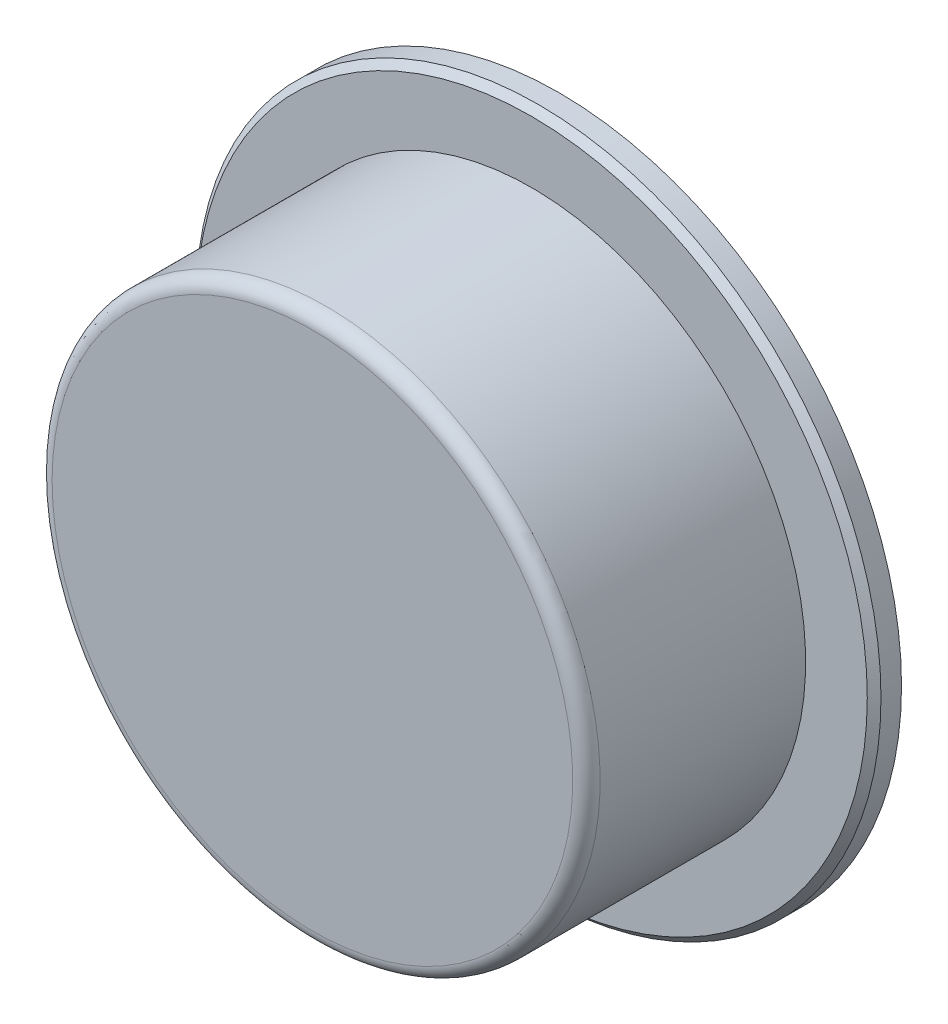
ISO-10303-21;
HEADER;
FILE_DESCRIPTION(('STEP AP214'),'2;1');
FILE_NAME('part.step','',(''),(''),'','','');
FILE_SCHEMA(('AUTOMOTIVE_DESIGN { 1 0 10303 214 1 1 1 1 }'));
ENDSEC;
DATA;
#1=APPLICATION_CONTEXT('core data for automotive mechanical design processes');
#2=APPLICATION_PROTOCOL_DEFINITION('international standard','automotive_design',2000,#1);
#3=PRODUCT_CONTEXT('',#1,'mechanical');
#4=PRODUCT('Part','Part','',(#3));
#5=PRODUCT_RELATED_PRODUCT_CATEGORY('part','',(#4));
#6=PRODUCT_DEFINITION_FORMATION('','',#4);
#7=PRODUCT_DEFINITION_CONTEXT('part definition',#1,'design');
#8=PRODUCT_DEFINITION('design','',#6,#7);
#9=PRODUCT_DEFINITION_SHAPE('','',#8);
#10=(LENGTH_UNIT() NAMED_UNIT(*) SI_UNIT(.MILLI.,.METRE.));
#11=(NAMED_UNIT(*) PLANE_ANGLE_UNIT() SI_UNIT($,.RADIAN.));
#12=(NAMED_UNIT(*) SI_UNIT($,.STERADIAN.) SOLID_ANGLE_UNIT());
#13=UNCERTAINTY_MEASURE_WITH_UNIT(LENGTH_MEASURE(1.E-05),#10,'distance_accuracy_value','');
#14=(GEOMETRIC_REPRESENTATION_CONTEXT(3) GLOBAL_UNCERTAINTY_ASSIGNED_CONTEXT((#13)) GLOBAL_UNIT_ASSIGNED_CONTEXT((#10,
#11,#12)) REPRESENTATION_CONTEXT('',''));
#15=CARTESIAN_POINT('',(0.,0.,0.));
#16=DIRECTION('',(0.,0.,1.));
#17=DIRECTION('',(1.,0.,0.));
#18=AXIS2_PLACEMENT_3D('',#15,#16,#17);
#19=CARTESIAN_POINT('',(0.,0.,3.4));
#20=DIRECTION('',(0.,0.,-1.));
#21=DIRECTION('',(-1.,0.,0.));
#22=AXIS2_PLACEMENT_3D('',#19,#20,#21);
#23=TOROIDAL_SURFACE('',#22,3.8,0.2);
#24=CARTESIAN_POINT('',(0.,0.,3.6));
#25=DIRECTION('',(0.,0.,-1.));
#26=DIRECTION('',(-1.,0.,0.));
#27=AXIS2_PLACEMENT_3D('',#24,#25,#26);
#28=CIRCLE('',#27,3.8);
#29=CARTESIAN_POINT('',(-3.8,0.,3.6));
#30=VERTEX_POINT('',#29);
#31=EDGE_CURVE('E49',#30,#30,#28,.T.);
#32=ORIENTED_EDGE('',*,*,#31,.T.);
#33=EDGE_LOOP('',(#32));
#34=FACE_BOUND('',#33,.T.);
#35=CARTESIAN_POINT('',(0.,0.,3.4));
#36=DIRECTION('',(0.,0.,-1.));
#37=DIRECTION('',(-1.,0.,0.));
#38=AXIS2_PLACEMENT_3D('',#35,#36,#37);
#39=CIRCLE('',#38,4.);
#40=CARTESIAN_POINT('',(-4.,0.,3.4));
#41=VERTEX_POINT('',#40);
#42=EDGE_CURVE('E61',#41,#41,#39,.T.);
#43=ORIENTED_EDGE('',*,*,#42,.F.);
#44=EDGE_LOOP('',(#43));
#45=FACE_BOUND('',#44,.T.);
#46=ADVANCED_FACE('F37',(#34,#45),#23,.T.);
#47=CARTESIAN_POINT('',(3.8,0.,3.6));
#48=DIRECTION('',(0.,0.,1.));
#49=DIRECTION('',(1.,0.,0.));
#50=AXIS2_PLACEMENT_3D('',#47,#48,#49);
#51=PLANE('',#50);
#52=ORIENTED_EDGE('',*,*,#31,.F.);
#53=EDGE_LOOP('',(#52));
#54=FACE_BOUND('',#53,.T.);
#55=ADVANCED_FACE('F69',(#54),#51,.T.);
#56=CARTESIAN_POINT('',(0.,0.,0.));
#57=DIRECTION('',(0.,0.,-1.));
#58=DIRECTION('',(-1.,0.,0.));
#59=AXIS2_PLACEMENT_3D('',#56,#57,#58);
#60=PLANE('',#59);
#61=CARTESIAN_POINT('',(0.,0.,0.));
#62=DIRECTION('',(0.,0.,-1.));
#63=DIRECTION('',(-1.,0.,0.));
#64=AXIS2_PLACEMENT_3D('',#61,#62,#63);
#65=CIRCLE('',#64,5.);
#66=CARTESIAN_POINT('',(-5.,0.,0.));
#67=VERTEX_POINT('',#66);
#68=EDGE_CURVE('E53',#67,#67,#65,.T.);
#69=ORIENTED_EDGE('',*,*,#68,.T.);
#70=EDGE_LOOP('',(#69));
#71=FACE_BOUND('',#70,.T.);
#72=ADVANCED_FACE('F74',(#71),#60,.T.);
#73=CARTESIAN_POINT('',(0.,0.,3.6));
#74=DIRECTION('',(0.,0.,-1.));
#75=DIRECTION('',(-1.,0.,0.));
#76=AXIS2_PLACEMENT_3D('',#73,#74,#75);
#77=CYLINDRICAL_SURFACE('',#76,5.);
#78=CARTESIAN_POINT('',(0.,0.,0.300000000000002));
#79=DIRECTION('',(0.,0.,1.));
#80=DIRECTION('',(1.,0.,0.));
#81=AXIS2_PLACEMENT_3D('',#78,#79,#80);
#82=CIRCLE('',#81,5.);
#83=CARTESIAN_POINT('',(-5.,0.,0.300000000000001));
#84=VERTEX_POINT('',#83);
#85=EDGE_CURVE('E45',#84,#84,#82,.F.);
#86=ORIENTED_EDGE('',*,*,#85,.T.);
#87=EDGE_LOOP('',(#86));
#88=FACE_BOUND('',#87,.T.);
#89=ORIENTED_EDGE('',*,*,#68,.F.);
#90=EDGE_LOOP('',(#89));
#91=FACE_BOUND('',#90,.T.);
#92=ADVANCED_FACE('F80',(#88,#91),#77,.T.);
#93=CARTESIAN_POINT('',(5.,0.,0.4));
#94=DIRECTION('',(0.,0.,1.));
#95=DIRECTION('',(1.,0.,0.));
#96=AXIS2_PLACEMENT_3D('',#93,#94,#95);
#97=PLANE('',#96);
#98=CARTESIAN_POINT('',(0.,0.,0.399999999999999));
#99=DIRECTION('',(0.,0.,1.));
#100=DIRECTION('',(1.,0.,0.));
#101=AXIS2_PLACEMENT_3D('',#98,#99,#100);
#102=CIRCLE('',#101,4.9);
#103=CARTESIAN_POINT('',(-4.9,0.,0.399999999999999));
#104=VERTEX_POINT('',#103);
#105=EDGE_CURVE('E10',#104,#104,#102,.T.);
#106=ORIENTED_EDGE('',*,*,#105,.T.);
#107=EDGE_LOOP('',(#106));
#108=FACE_BOUND('',#107,.T.);
#109=CARTESIAN_POINT('',(0.,0.,0.4));
#110=DIRECTION('',(0.,0.,-1.));
#111=DIRECTION('',(-1.,0.,0.));
#112=AXIS2_PLACEMENT_3D('',#109,#110,#111);
#113=CIRCLE('',#112,4.);
#114=CARTESIAN_POINT('',(-4.,0.,0.399999999999999));
#115=VERTEX_POINT('',#114);
#116=EDGE_CURVE('E58',#115,#115,#113,.T.);
#117=ORIENTED_EDGE('',*,*,#116,.T.);
#118=EDGE_LOOP('',(#117));
#119=FACE_BOUND('',#118,.T.);
#120=ADVANCED_FACE('F84',(#108,#119),#97,.T.);
#121=CARTESIAN_POINT('',(0.,0.,3.6));
#122=DIRECTION('',(0.,0.,-1.));
#123=DIRECTION('',(-1.,0.,0.));
#124=AXIS2_PLACEMENT_3D('',#121,#122,#123);
#125=CYLINDRICAL_SURFACE('',#124,4.);
#126=ORIENTED_EDGE('',*,*,#42,.T.);
#127=EDGE_LOOP('',(#126));
#128=FACE_BOUND('',#127,.T.);
#129=ORIENTED_EDGE('',*,*,#116,.F.);
#130=EDGE_LOOP('',(#129));
#131=FACE_BOUND('',#130,.T.);
#132=ADVANCED_FACE('F65',(#128,#131),#125,.T.);
#133=CARTESIAN_POINT('',(0.,0.,0.300000000000003));
#134=DIRECTION('',(0.,0.,-1.));
#135=DIRECTION('',(-1.,0.,0.));
#136=AXIS2_PLACEMENT_3D('',#133,#134,#135);
#137=CONICAL_SURFACE('',#136,5.,0.785398163397457);
#138=CARTESIAN_POINT('',(-4.9,0.,0.399999999999999));
#139=CARTESIAN_POINT('',(-4.90104166666667,0.,0.398958333333332));
#140=CARTESIAN_POINT('',(-4.90208333333334,0.,0.397916666666666));
#141=CARTESIAN_POINT('',(-4.90416666666667,0.,0.395833333333332));
#142=CARTESIAN_POINT('',(-4.90520833333334,0.,0.394791666666666));
#143=CARTESIAN_POINT('',(-4.90729166666667,0.,0.392708333333332));
#144=CARTESIAN_POINT('',(-4.90833333333333,0.,0.391666666666666));
#145=CARTESIAN_POINT('',(-4.91041666666667,0.,0.389583333333332));
#146=CARTESIAN_POINT('',(-4.91145833333334,0.,0.388541666666666));
#147=CARTESIAN_POINT('',(-4.91354166666667,0.,0.386458333333333));
#148=CARTESIAN_POINT('',(-4.91458333333333,0.,0.385416666666666));
#149=CARTESIAN_POINT('',(-4.91666666666667,0.,0.383333333333333));
#150=CARTESIAN_POINT('',(-4.91770833333334,0.,0.382291666666666));
#151=CARTESIAN_POINT('',(-4.91979166666667,0.,0.380208333333333));
#152=CARTESIAN_POINT('',(-4.92083333333334,0.,0.379166666666666));
#153=CARTESIAN_POINT('',(-4.92291666666667,0.,0.377083333333333));
#154=CARTESIAN_POINT('',(-4.92395833333333,0.,0.376041666666666));
#155=CARTESIAN_POINT('',(-4.92604166666667,0.,0.373958333333333));
#156=CARTESIAN_POINT('',(-4.92708333333334,0.,0.372916666666666));
#157=CARTESIAN_POINT('',(-4.92916666666667,0.,0.370833333333333));
#158=CARTESIAN_POINT('',(-4.93020833333333,0.,0.369791666666666));
#159=CARTESIAN_POINT('',(-4.93229166666667,0.,0.367708333333333));
#160=CARTESIAN_POINT('',(-4.93333333333333,0.,0.366666666666666));
#161=CARTESIAN_POINT('',(-4.93541666666667,0.,0.364583333333333));
#162=CARTESIAN_POINT('',(-4.93645833333334,0.,0.363541666666667));
#163=CARTESIAN_POINT('',(-4.93854166666667,0.,0.361458333333333));
#164=CARTESIAN_POINT('',(-4.93958333333333,0.,0.360416666666667));
#165=CARTESIAN_POINT('',(-4.94166666666667,0.,0.358333333333333));
#166=CARTESIAN_POINT('',(-4.94270833333333,0.,0.357291666666667));
#167=CARTESIAN_POINT('',(-4.94479166666667,0.,0.355208333333333));
#168=CARTESIAN_POINT('',(-4.94583333333333,0.,0.354166666666667));
#169=CARTESIAN_POINT('',(-4.94791666666667,0.,0.352083333333334));
#170=CARTESIAN_POINT('',(-4.94895833333333,0.,0.351041666666667));
#171=CARTESIAN_POINT('',(-4.95104166666667,0.,0.348958333333333));
#172=CARTESIAN_POINT('',(-4.95208333333334,0.,0.347916666666667));
#173=CARTESIAN_POINT('',(-4.95416666666667,0.,0.345833333333334));
#174=CARTESIAN_POINT('',(-4.95520833333333,0.,0.344791666666667));
#175=CARTESIAN_POINT('',(-4.95729166666667,0.,0.342708333333334));
#176=CARTESIAN_POINT('',(-4.95833333333333,0.,0.341666666666667));
#177=CARTESIAN_POINT('',(-4.96041666666667,0.,0.339583333333334));
#178=CARTESIAN_POINT('',(-4.96145833333333,0.,0.338541666666667));
#179=CARTESIAN_POINT('',(-4.96354166666667,0.,0.336458333333334));
#180=CARTESIAN_POINT('',(-4.96458333333333,0.,0.335416666666667));
#181=CARTESIAN_POINT('',(-4.96666666666667,0.,0.333333333333334));
#182=CARTESIAN_POINT('',(-4.96770833333333,0.,0.332291666666667));
#183=CARTESIAN_POINT('',(-4.96979166666667,0.,0.330208333333334));
#184=CARTESIAN_POINT('',(-4.97083333333333,0.,0.329166666666667));
#185=CARTESIAN_POINT('',(-4.97291666666667,0.,0.327083333333334));
#186=CARTESIAN_POINT('',(-4.97395833333333,0.,0.326041666666668));
#187=CARTESIAN_POINT('',(-4.97604166666667,0.,0.323958333333334));
#188=CARTESIAN_POINT('',(-4.97708333333333,0.,0.322916666666667));
#189=CARTESIAN_POINT('',(-4.97916666666667,0.,0.320833333333334));
#190=CARTESIAN_POINT('',(-4.98020833333333,0.,0.319791666666668));
#191=CARTESIAN_POINT('',(-4.98229166666667,0.,0.317708333333334));
#192=CARTESIAN_POINT('',(-4.98333333333333,0.,0.316666666666668));
#193=CARTESIAN_POINT('',(-4.98541666666667,0.,0.314583333333334));
#194=CARTESIAN_POINT('',(-4.98645833333333,0.,0.313541666666668));
#195=CARTESIAN_POINT('',(-4.98854166666667,0.,0.311458333333335));
#196=CARTESIAN_POINT('',(-4.98958333333333,0.,0.310416666666668));
#197=CARTESIAN_POINT('',(-4.99166666666667,0.,0.308333333333335));
#198=CARTESIAN_POINT('',(-4.99270833333333,0.,0.307291666666668));
#199=CARTESIAN_POINT('',(-4.99479166666667,0.,0.305208333333335));
#200=CARTESIAN_POINT('',(-4.99583333333333,0.,0.304166666666668));
#201=CARTESIAN_POINT('',(-4.99791666666667,0.,0.302083333333335));
#202=CARTESIAN_POINT('',(-4.99895833333333,0.,0.301041666666668));
#203=CARTESIAN_POINT('',(-5.,0.,0.300000000000001));
#204=B_SPLINE_CURVE_WITH_KNOTS('',3,(#138,#139,#140,#141,#142,#143,#144,#145,#146,#147,#148,
#149,#150,#151,#152,#153,#154,#155,#156,#157,#158,#159,#160,#161,#162,#163,#164,#165,#166,#167,
#168,#169,#170,#171,#172,#173,#174,#175,#176,#177,#178,#179,#180,#181,#182,#183,#184,#185,#186,
#187,#188,#189,#190,#191,#192,#193,#194,#195,#196,#197,#198,#199,#200,#201,#202,#203),
.UNSPECIFIED.,.F.,.F.,(4,2,2,2,2,2,2,2,2,2,2,2,2,2,2,2,2,2,2,2,2,2,2,2,2,2,2,2,2,2,2,2,4),(0.,
0.00441941738241624,0.00883883476483183,0.0132582521472475,0.0176776695296637,
0.0220970869120793,0.0265165042944956,0.0309359216769112,0.0353553390593268,0.039774756441743,
0.0441941738241586,0.0486135912065743,0.0530330085889905,0.0574524259714061,0.0618718433538217,
0.066291260736238,0.0707106781186536,0.0751300955010698,0.0795495128834855,0.0839689302659011,
0.0883883476483173,0.0928077650307329,0.0972271824131486,0.101646599795565,0.10606601717798,
0.110485434560396,0.114904851942812,0.119324269325228,0.123743686707644,0.12816310409006,
0.132582521472475,0.137001938854892,0.141421356237307),.UNSPECIFIED.);
#205=EDGE_CURVE('BSEAM40',#104,#84,#204,.T.);
#206=ORIENTED_EDGE('',*,*,#105,.F.);
#207=ORIENTED_EDGE('',*,*,#85,.F.);
#208=ORIENTED_EDGE('',*,*,#205,.T.);
#209=ORIENTED_EDGE('',*,*,#205,.F.);
#210=EDGE_LOOP('',(#206,#208,#207,#209));
#211=FACE_BOUND('',#210,.T.);
#212=ADVANCED_FACE('F40',(#211),#137,.T.);
#213=CLOSED_SHELL('',(#46,#55,#72,#92,#120,#132,#212));
#214=MANIFOLD_SOLID_BREP('B2',#213);
#215=ADVANCED_BREP_SHAPE_REPRESENTATION('',(#18,#214),#14);
#216=SHAPE_DEFINITION_REPRESENTATION(#9,#215);
ENDSEC;
END-ISO-10303-21;
